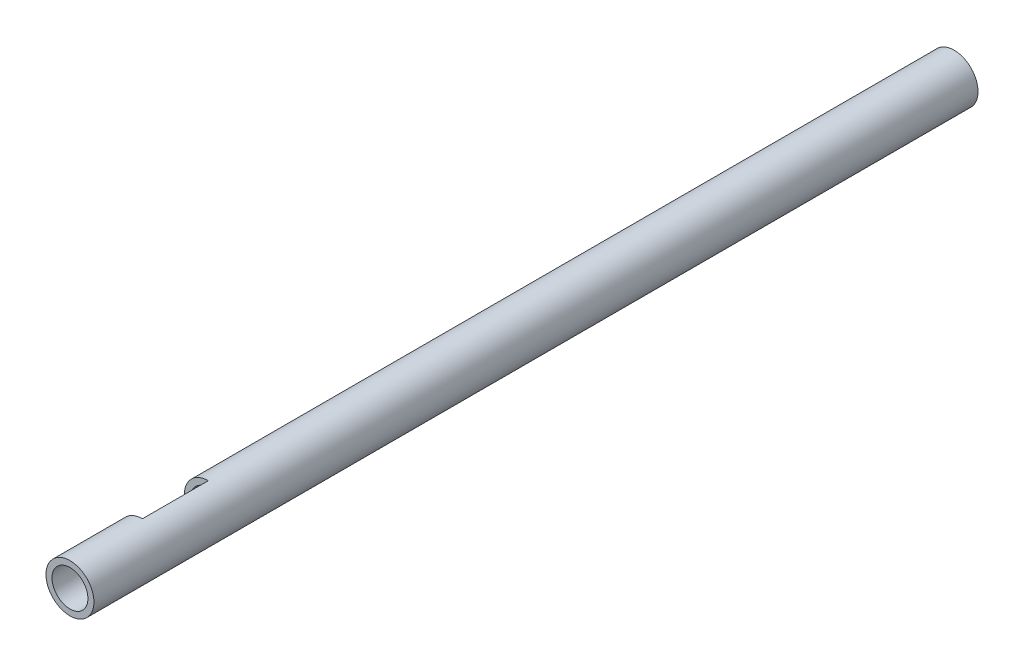
ISO-10303-21;
HEADER;
FILE_DESCRIPTION(('STEP AP214'),'2;1');
FILE_NAME('part.step','',(''),(''),'','','');
FILE_SCHEMA(('AUTOMOTIVE_DESIGN { 1 0 10303 214 1 1 1 1 }'));
ENDSEC;
DATA;
#1=APPLICATION_CONTEXT('core data for automotive mechanical design processes');
#2=APPLICATION_PROTOCOL_DEFINITION('international standard','automotive_design',2000,#1);
#3=PRODUCT_CONTEXT('',#1,'mechanical');
#4=PRODUCT('Part','Part','',(#3));
#5=PRODUCT_RELATED_PRODUCT_CATEGORY('part','',(#4));
#6=PRODUCT_DEFINITION_FORMATION('','',#4);
#7=PRODUCT_DEFINITION_CONTEXT('part definition',#1,'design');
#8=PRODUCT_DEFINITION('design','',#6,#7);
#9=PRODUCT_DEFINITION_SHAPE('','',#8);
#10=(LENGTH_UNIT() NAMED_UNIT(*) SI_UNIT(.MILLI.,.METRE.));
#11=(NAMED_UNIT(*) PLANE_ANGLE_UNIT() SI_UNIT($,.RADIAN.));
#12=(NAMED_UNIT(*) SI_UNIT($,.STERADIAN.) SOLID_ANGLE_UNIT());
#13=UNCERTAINTY_MEASURE_WITH_UNIT(LENGTH_MEASURE(1.E-05),#10,'distance_accuracy_value','');
#14=(GEOMETRIC_REPRESENTATION_CONTEXT(3) GLOBAL_UNCERTAINTY_ASSIGNED_CONTEXT((#13)) GLOBAL_UNIT_ASSIGNED_CONTEXT((#10,
#11,#12)) REPRESENTATION_CONTEXT('',''));
#15=CARTESIAN_POINT('',(0.,0.,0.));
#16=DIRECTION('',(0.,0.,1.));
#17=DIRECTION('',(1.,0.,0.));
#18=AXIS2_PLACEMENT_3D('',#15,#16,#17);
#19=CARTESIAN_POINT('',(0.,20.,0.));
#20=DIRECTION('',(0.,0.,-1.));
#21=DIRECTION('',(-1.,0.,0.));
#22=AXIS2_PLACEMENT_3D('',#19,#20,#21);
#23=PLANE('',#22);
#24=CARTESIAN_POINT('',(0.,0.,0.));
#25=DIRECTION('',(0.,0.,-1.));
#26=DIRECTION('',(-1.,0.,0.));
#27=AXIS2_PLACEMENT_3D('',#24,#25,#26);
#28=CIRCLE('',#27,20.);
#29=CARTESIAN_POINT('',(-20.,0.,0.));
#30=VERTEX_POINT('',#29);
#31=EDGE_CURVE('E103',#30,#30,#28,.T.);
#32=ORIENTED_EDGE('',*,*,#31,.T.);
#33=EDGE_LOOP('',(#32));
#34=FACE_BOUND('',#33,.T.);
#35=CARTESIAN_POINT('',(0.,0.,0.));
#36=DIRECTION('',(0.,0.,-1.));
#37=DIRECTION('',(-1.,0.,0.));
#38=AXIS2_PLACEMENT_3D('',#35,#36,#37);
#39=CIRCLE('',#38,15.);
#40=CARTESIAN_POINT('',(-15.,0.,0.));
#41=VERTEX_POINT('',#40);
#42=EDGE_CURVE('E112',#41,#41,#39,.T.);
#43=ORIENTED_EDGE('',*,*,#42,.F.);
#44=EDGE_LOOP('',(#43));
#45=FACE_BOUND('',#44,.T.);
#46=ADVANCED_FACE('F33',(#34,#45),#23,.T.);
#47=CARTESIAN_POINT('',(0.,0.,0.));
#48=DIRECTION('',(0.,0.,-1.));
#49=DIRECTION('',(-1.,0.,0.));
#50=AXIS2_PLACEMENT_3D('',#47,#48,#49);
#51=CYLINDRICAL_SURFACE('',#50,15.);
#52=CARTESIAN_POINT('',(0.,0.,622.5));
#53=DIRECTION('',(0.,0.,-1.));
#54=DIRECTION('',(-1.,0.,0.));
#55=AXIS2_PLACEMENT_3D('',#52,#53,#54);
#56=CIRCLE('',#55,15.);
#57=CARTESIAN_POINT('',(0.,-15.,622.5));
#58=VERTEX_POINT('',#57);
#59=CARTESIAN_POINT('',(0.,15.,622.5));
#60=VERTEX_POINT('',#59);
#61=EDGE_CURVE('E75',#58,#60,#56,.T.);
#62=ORIENTED_EDGE('',*,*,#61,.F.);
#63=DIRECTION('',(0.,0.,-1.));
#64=VECTOR('',#63,1.);
#65=CARTESIAN_POINT('',(-1.2445473096335E-13,-15.,0.));
#66=LINE('',#65,#64);
#67=CARTESIAN_POINT('',(0.,-15.,677.5));
#68=VERTEX_POINT('',#67);
#69=EDGE_CURVE('E100',#68,#58,#66,.T.);
#70=ORIENTED_EDGE('',*,*,#69,.F.);
#71=CARTESIAN_POINT('',(0.,0.,677.5));
#72=DIRECTION('',(0.,0.,1.));
#73=DIRECTION('',(1.,0.,0.));
#74=AXIS2_PLACEMENT_3D('',#71,#72,#73);
#75=CIRCLE('',#74,15.);
#76=CARTESIAN_POINT('',(0.,15.,677.5));
#77=VERTEX_POINT('',#76);
#78=EDGE_CURVE('E95',#77,#68,#75,.T.);
#79=ORIENTED_EDGE('',*,*,#78,.F.);
#80=DIRECTION('',(0.,0.,-1.));
#81=VECTOR('',#80,1.);
#82=CARTESIAN_POINT('',(-1.2445473096335E-13,15.,0.));
#83=LINE('',#82,#81);
#84=EDGE_CURVE('E98',#60,#77,#83,.F.);
#85=ORIENTED_EDGE('',*,*,#84,.F.);
#86=EDGE_LOOP('',(#62,#70,#79,#85));
#87=FACE_BOUND('',#86,.T.);
#88=ORIENTED_EDGE('',*,*,#42,.T.);
#89=EDGE_LOOP('',(#88));
#90=FACE_BOUND('',#89,.T.);
#91=CARTESIAN_POINT('',(0.,0.,738.));
#92=DIRECTION('',(0.,0.,-1.));
#93=DIRECTION('',(-1.,0.,0.));
#94=AXIS2_PLACEMENT_3D('',#91,#92,#93);
#95=CIRCLE('',#94,14.9999999999999);
#96=CARTESIAN_POINT('',(-14.9999999999999,0.,738.));
#97=VERTEX_POINT('',#96);
#98=EDGE_CURVE('E109',#97,#97,#95,.T.);
#99=ORIENTED_EDGE('',*,*,#98,.F.);
#100=EDGE_LOOP('',(#99));
#101=FACE_BOUND('',#100,.T.);
#102=ADVANCED_FACE('F119',(#87,#90,#101),#51,.F.);
#103=CARTESIAN_POINT('',(0.,19.9999999999999,738.));
#104=DIRECTION('',(0.,0.,1.));
#105=DIRECTION('',(1.,0.,0.));
#106=AXIS2_PLACEMENT_3D('',#103,#104,#105);
#107=PLANE('',#106);
#108=ORIENTED_EDGE('',*,*,#98,.T.);
#109=EDGE_LOOP('',(#108));
#110=FACE_BOUND('',#109,.T.);
#111=CARTESIAN_POINT('',(0.,0.,738.));
#112=DIRECTION('',(0.,0.,-1.));
#113=DIRECTION('',(-1.,0.,0.));
#114=AXIS2_PLACEMENT_3D('',#111,#112,#113);
#115=CIRCLE('',#114,19.9999999999999);
#116=CARTESIAN_POINT('',(-19.9999999999999,0.,738.));
#117=VERTEX_POINT('',#116);
#118=EDGE_CURVE('E106',#117,#117,#115,.T.);
#119=ORIENTED_EDGE('',*,*,#118,.F.);
#120=EDGE_LOOP('',(#119));
#121=FACE_BOUND('',#120,.T.);
#122=ADVANCED_FACE('F122',(#110,#121),#107,.T.);
#123=CARTESIAN_POINT('',(0.,0.,0.));
#124=DIRECTION('',(0.,0.,-1.));
#125=DIRECTION('',(-1.,0.,0.));
#126=AXIS2_PLACEMENT_3D('',#123,#124,#125);
#127=CYLINDRICAL_SURFACE('',#126,20.);
#128=CARTESIAN_POINT('',(0.,0.,622.5));
#129=DIRECTION('',(0.,0.,-1.));
#130=DIRECTION('',(-1.,0.,0.));
#131=AXIS2_PLACEMENT_3D('',#128,#129,#130);
#132=CIRCLE('',#131,20.);
#133=CARTESIAN_POINT('',(0.,20.,622.5));
#134=VERTEX_POINT('',#133);
#135=CARTESIAN_POINT('',(0.,-20.,622.5));
#136=VERTEX_POINT('',#135);
#137=EDGE_CURVE('E11',#134,#136,#132,.F.);
#138=ORIENTED_EDGE('',*,*,#137,.F.);
#139=DIRECTION('',(0.,0.,-1.));
#140=VECTOR('',#139,1.);
#141=CARTESIAN_POINT('',(0.,20.,622.5));
#142=LINE('',#141,#140);
#143=CARTESIAN_POINT('',(0.,20.,677.5));
#144=VERTEX_POINT('',#143);
#145=EDGE_CURVE('E81',#144,#134,#142,.T.);
#146=ORIENTED_EDGE('',*,*,#145,.F.);
#147=CARTESIAN_POINT('',(0.,0.,677.5));
#148=DIRECTION('',(0.,0.,1.));
#149=DIRECTION('',(1.,0.,0.));
#150=AXIS2_PLACEMENT_3D('',#147,#148,#149);
#151=CIRCLE('',#150,20.);
#152=CARTESIAN_POINT('',(0.,-20.,677.5));
#153=VERTEX_POINT('',#152);
#154=EDGE_CURVE('E40',#153,#144,#151,.F.);
#155=ORIENTED_EDGE('',*,*,#154,.F.);
#156=DIRECTION('',(0.,0.,-1.));
#157=VECTOR('',#156,1.);
#158=CARTESIAN_POINT('',(0.,-20.,622.5));
#159=LINE('',#158,#157);
#160=EDGE_CURVE('E85',#153,#136,#159,.T.);
#161=ORIENTED_EDGE('',*,*,#160,.T.);
#162=EDGE_LOOP('',(#138,#146,#155,#161));
#163=FACE_BOUND('',#162,.T.);
#164=ORIENTED_EDGE('',*,*,#118,.T.);
#165=EDGE_LOOP('',(#164));
#166=FACE_BOUND('',#165,.T.);
#167=ORIENTED_EDGE('',*,*,#31,.F.);
#168=EDGE_LOOP('',(#167));
#169=FACE_BOUND('',#168,.T.);
#170=ADVANCED_FACE('F88',(#163,#166,#169),#127,.T.);
#171=CARTESIAN_POINT('',(0.,-20.,622.5));
#172=DIRECTION('',(1.,0.,0.));
#173=DIRECTION('',(0.,0.,-1.));
#174=AXIS2_PLACEMENT_3D('',#171,#172,#173);
#175=PLANE('',#174);
#176=ORIENTED_EDGE('',*,*,#69,.T.);
#177=DIRECTION('',(0.,1.,0.));
#178=VECTOR('',#177,1.);
#179=CARTESIAN_POINT('',(0.,-20.,622.5));
#180=LINE('',#179,#178);
#181=EDGE_CURVE('E77',#136,#58,#180,.T.);
#182=ORIENTED_EDGE('',*,*,#181,.F.);
#183=ORIENTED_EDGE('',*,*,#160,.F.);
#184=DIRECTION('',(0.,1.,0.));
#185=VECTOR('',#184,1.);
#186=CARTESIAN_POINT('',(0.,-20.,677.5));
#187=LINE('',#186,#185);
#188=EDGE_CURVE('E78',#153,#68,#187,.T.);
#189=ORIENTED_EDGE('',*,*,#188,.T.);
#190=EDGE_LOOP('',(#176,#182,#183,#189));
#191=FACE_BOUND('',#190,.T.);
#192=ADVANCED_FACE('F117',(#191),#175,.F.);
#193=CARTESIAN_POINT('',(-37.7147515339686,-20.,622.5));
#194=DIRECTION('',(0.,0.,-1.));
#195=DIRECTION('',(-1.,0.,0.));
#196=AXIS2_PLACEMENT_3D('',#193,#194,#195);
#197=PLANE('',#196);
#198=ORIENTED_EDGE('',*,*,#61,.T.);
#199=EDGE_CURVE('E69',#60,#134,#180,.T.);
#200=ORIENTED_EDGE('',*,*,#199,.T.);
#201=ORIENTED_EDGE('',*,*,#137,.T.);
#202=ORIENTED_EDGE('',*,*,#181,.T.);
#203=EDGE_LOOP('',(#198,#200,#201,#202));
#204=FACE_BOUND('',#203,.T.);
#205=ADVANCED_FACE('F70',(#204),#197,.F.);
#206=ORIENTED_EDGE('',*,*,#84,.T.);
#207=EDGE_CURVE('E47',#77,#144,#187,.T.);
#208=ORIENTED_EDGE('',*,*,#207,.T.);
#209=ORIENTED_EDGE('',*,*,#145,.T.);
#210=ORIENTED_EDGE('',*,*,#199,.F.);
#211=EDGE_LOOP('',(#206,#208,#209,#210));
#212=FACE_BOUND('',#211,.T.);
#213=ADVANCED_FACE('F82',(#212),#175,.F.);
#214=CARTESIAN_POINT('',(-37.7147515339686,-20.,677.5));
#215=DIRECTION('',(0.,0.,1.));
#216=DIRECTION('',(1.,0.,0.));
#217=AXIS2_PLACEMENT_3D('',#214,#215,#216);
#218=PLANE('',#217);
#219=ORIENTED_EDGE('',*,*,#78,.T.);
#220=ORIENTED_EDGE('',*,*,#188,.F.);
#221=ORIENTED_EDGE('',*,*,#154,.T.);
#222=ORIENTED_EDGE('',*,*,#207,.F.);
#223=EDGE_LOOP('',(#219,#220,#221,#222));
#224=FACE_BOUND('',#223,.T.);
#225=ADVANCED_FACE('F114',(#224),#218,.F.);
#226=CLOSED_SHELL('',(#46,#102,#122,#170,#192,#205,#213,#225));
#227=MANIFOLD_SOLID_BREP('B2',#226);
#228=ADVANCED_BREP_SHAPE_REPRESENTATION('',(#18,#227),#14);
#229=SHAPE_DEFINITION_REPRESENTATION(#9,#228);
ENDSEC;
END-ISO-10303-21;
